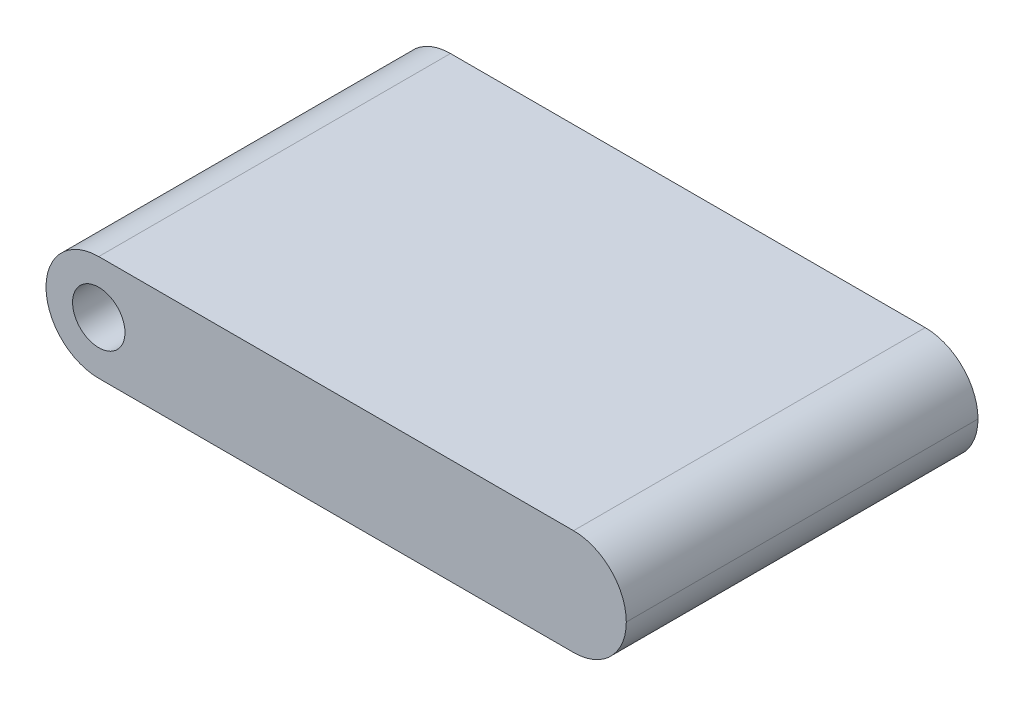
ISO-10303-21;
HEADER;
FILE_DESCRIPTION(('STEP AP214'),'2;1');
FILE_NAME('part.step','',(''),(''),'','','');
FILE_SCHEMA(('AUTOMOTIVE_DESIGN { 1 0 10303 214 1 1 1 1 }'));
ENDSEC;
DATA;
#1=APPLICATION_CONTEXT('core data for automotive mechanical design processes');
#2=APPLICATION_PROTOCOL_DEFINITION('international standard','automotive_design',2000,#1);
#3=PRODUCT_CONTEXT('',#1,'mechanical');
#4=PRODUCT('Part','Part','',(#3));
#5=PRODUCT_RELATED_PRODUCT_CATEGORY('part','',(#4));
#6=PRODUCT_DEFINITION_FORMATION('','',#4);
#7=PRODUCT_DEFINITION_CONTEXT('part definition',#1,'design');
#8=PRODUCT_DEFINITION('design','',#6,#7);
#9=PRODUCT_DEFINITION_SHAPE('','',#8);
#10=(LENGTH_UNIT() NAMED_UNIT(*) SI_UNIT(.MILLI.,.METRE.));
#11=(NAMED_UNIT(*) PLANE_ANGLE_UNIT() SI_UNIT($,.RADIAN.));
#12=(NAMED_UNIT(*) SI_UNIT($,.STERADIAN.) SOLID_ANGLE_UNIT());
#13=UNCERTAINTY_MEASURE_WITH_UNIT(LENGTH_MEASURE(1.E-05),#10,'distance_accuracy_value','');
#14=(GEOMETRIC_REPRESENTATION_CONTEXT(3) GLOBAL_UNCERTAINTY_ASSIGNED_CONTEXT((#13)) GLOBAL_UNIT_ASSIGNED_CONTEXT((#10,
#11,#12)) REPRESENTATION_CONTEXT('',''));
#15=CARTESIAN_POINT('',(0.,0.,0.));
#16=DIRECTION('',(0.,0.,1.));
#17=DIRECTION('',(1.,0.,0.));
#18=AXIS2_PLACEMENT_3D('',#15,#16,#17);
#19=CARTESIAN_POINT('',(0.,0.,20.));
#20=DIRECTION('',(0.,0.,1.));
#21=DIRECTION('',(1.,0.,0.));
#22=AXIS2_PLACEMENT_3D('',#19,#20,#21);
#23=PLANE('',#22);
#24=DIRECTION('',(1.,0.,0.));
#25=VECTOR('',#24,1.);
#26=CARTESIAN_POINT('',(-6.,-6.,20.));
#27=LINE('',#26,#25);
#28=CARTESIAN_POINT('',(0.,-6.,20.));
#29=VERTEX_POINT('',#28);
#30=CARTESIAN_POINT('',(54.,-6.,20.));
#31=VERTEX_POINT('',#30);
#32=EDGE_CURVE('E111',#29,#31,#27,.T.);
#33=ORIENTED_EDGE('',*,*,#32,.T.);
#34=CARTESIAN_POINT('',(54.,0.,20.));
#35=DIRECTION('',(0.,0.,1.));
#36=DIRECTION('',(1.,0.,0.));
#37=AXIS2_PLACEMENT_3D('',#34,#35,#36);
#38=CIRCLE('',#37,6.);
#39=CARTESIAN_POINT('',(60.,0.,20.));
#40=VERTEX_POINT('',#39);
#41=EDGE_CURVE('E138',#31,#40,#38,.T.);
#42=ORIENTED_EDGE('',*,*,#41,.T.);
#43=CARTESIAN_POINT('',(54.,0.,20.));
#44=DIRECTION('',(0.,0.,1.));
#45=DIRECTION('',(1.,0.,0.));
#46=AXIS2_PLACEMENT_3D('',#43,#44,#45);
#47=CIRCLE('',#46,6.);
#48=CARTESIAN_POINT('',(54.,6.00000000000001,20.));
#49=VERTEX_POINT('',#48);
#50=EDGE_CURVE('E136',#40,#49,#47,.T.);
#51=ORIENTED_EDGE('',*,*,#50,.T.);
#52=DIRECTION('',(-1.,0.,0.));
#53=VECTOR('',#52,1.);
#54=CARTESIAN_POINT('',(60.,6.00000000000002,20.));
#55=LINE('',#54,#53);
#56=CARTESIAN_POINT('',(0.,6.,20.));
#57=VERTEX_POINT('',#56);
#58=EDGE_CURVE('E126',#49,#57,#55,.T.);
#59=ORIENTED_EDGE('',*,*,#58,.T.);
#60=CARTESIAN_POINT('',(0.,0.,20.));
#61=DIRECTION('',(0.,0.,1.));
#62=DIRECTION('',(1.,0.,0.));
#63=AXIS2_PLACEMENT_3D('',#60,#61,#62);
#64=CIRCLE('',#63,6.);
#65=CARTESIAN_POINT('',(-6.,0.,20.));
#66=VERTEX_POINT('',#65);
#67=EDGE_CURVE('E54',#57,#66,#64,.T.);
#68=ORIENTED_EDGE('',*,*,#67,.T.);
#69=CARTESIAN_POINT('',(0.,0.,20.));
#70=DIRECTION('',(0.,0.,1.));
#71=DIRECTION('',(1.,0.,0.));
#72=AXIS2_PLACEMENT_3D('',#69,#70,#71);
#73=CIRCLE('',#72,6.);
#74=EDGE_CURVE('E134',#66,#29,#73,.T.);
#75=ORIENTED_EDGE('',*,*,#74,.T.);
#76=EDGE_LOOP('',(#33,#42,#51,#59,#68,#75));
#77=FACE_BOUND('',#76,.T.);
#78=CARTESIAN_POINT('',(0.,0.,20.));
#79=DIRECTION('',(0.,0.,1.));
#80=DIRECTION('',(1.,0.,0.));
#81=AXIS2_PLACEMENT_3D('',#78,#79,#80);
#82=CIRCLE('',#81,2.98);
#83=CARTESIAN_POINT('',(2.98,0.,20.));
#84=VERTEX_POINT('',#83);
#85=EDGE_CURVE('E119',#84,#84,#82,.T.);
#86=ORIENTED_EDGE('',*,*,#85,.F.);
#87=EDGE_LOOP('',(#86));
#88=FACE_BOUND('',#87,.T.);
#89=ADVANCED_FACE('F37',(#77,#88),#23,.T.);
#90=CARTESIAN_POINT('',(0.,0.,-20.));
#91=DIRECTION('',(0.,0.,1.));
#92=DIRECTION('',(1.,0.,0.));
#93=AXIS2_PLACEMENT_3D('',#90,#91,#92);
#94=PLANE('',#93);
#95=CARTESIAN_POINT('',(54.,0.,-20.));
#96=DIRECTION('',(0.,0.,1.));
#97=DIRECTION('',(1.,0.,0.));
#98=AXIS2_PLACEMENT_3D('',#95,#96,#97);
#99=CIRCLE('',#98,6.);
#100=CARTESIAN_POINT('',(54.,6.00000000000001,-20.));
#101=VERTEX_POINT('',#100);
#102=CARTESIAN_POINT('',(60.,0.,-20.));
#103=VERTEX_POINT('',#102);
#104=EDGE_CURVE('E100',#101,#103,#99,.F.);
#105=ORIENTED_EDGE('',*,*,#104,.T.);
#106=CARTESIAN_POINT('',(54.,0.,-20.));
#107=DIRECTION('',(0.,0.,1.));
#108=DIRECTION('',(1.,0.,0.));
#109=AXIS2_PLACEMENT_3D('',#106,#107,#108);
#110=CIRCLE('',#109,6.);
#111=CARTESIAN_POINT('',(54.,-6.,-20.));
#112=VERTEX_POINT('',#111);
#113=EDGE_CURVE('E113',#103,#112,#110,.F.);
#114=ORIENTED_EDGE('',*,*,#113,.T.);
#115=DIRECTION('',(1.,0.,0.));
#116=VECTOR('',#115,1.);
#117=CARTESIAN_POINT('',(-6.,-6.,-20.));
#118=LINE('',#117,#116);
#119=CARTESIAN_POINT('',(0.,-6.,-20.));
#120=VERTEX_POINT('',#119);
#121=EDGE_CURVE('E108',#120,#112,#118,.T.);
#122=ORIENTED_EDGE('',*,*,#121,.F.);
#123=CARTESIAN_POINT('',(0.,0.,-20.));
#124=DIRECTION('',(0.,0.,1.));
#125=DIRECTION('',(1.,0.,0.));
#126=AXIS2_PLACEMENT_3D('',#123,#124,#125);
#127=CIRCLE('',#126,6.);
#128=CARTESIAN_POINT('',(-6.,0.,-20.));
#129=VERTEX_POINT('',#128);
#130=EDGE_CURVE('E92',#120,#129,#127,.F.);
#131=ORIENTED_EDGE('',*,*,#130,.T.);
#132=CARTESIAN_POINT('',(0.,0.,-20.));
#133=DIRECTION('',(0.,0.,1.));
#134=DIRECTION('',(1.,0.,0.));
#135=AXIS2_PLACEMENT_3D('',#132,#133,#134);
#136=CIRCLE('',#135,6.);
#137=CARTESIAN_POINT('',(0.,6.,-20.));
#138=VERTEX_POINT('',#137);
#139=EDGE_CURVE('E101',#129,#138,#136,.F.);
#140=ORIENTED_EDGE('',*,*,#139,.T.);
#141=DIRECTION('',(-1.,0.,0.));
#142=VECTOR('',#141,1.);
#143=CARTESIAN_POINT('',(60.,6.00000000000002,-20.));
#144=LINE('',#143,#142);
#145=EDGE_CURVE('E118',#101,#138,#144,.T.);
#146=ORIENTED_EDGE('',*,*,#145,.F.);
#147=EDGE_LOOP('',(#105,#114,#122,#131,#140,#146));
#148=FACE_BOUND('',#147,.T.);
#149=CARTESIAN_POINT('',(0.,0.,-20.));
#150=DIRECTION('',(0.,0.,1.));
#151=DIRECTION('',(1.,0.,0.));
#152=AXIS2_PLACEMENT_3D('',#149,#150,#151);
#153=CIRCLE('',#152,2.98);
#154=CARTESIAN_POINT('',(2.98,0.,-20.));
#155=VERTEX_POINT('',#154);
#156=EDGE_CURVE('E123',#155,#155,#153,.T.);
#157=ORIENTED_EDGE('',*,*,#156,.T.);
#158=EDGE_LOOP('',(#157));
#159=FACE_BOUND('',#158,.T.);
#160=ADVANCED_FACE('F115',(#148,#159),#94,.F.);
#161=CARTESIAN_POINT('',(-6.,-6.,20.));
#162=DIRECTION('',(0.,1.,0.));
#163=DIRECTION('',(0.,0.,1.));
#164=AXIS2_PLACEMENT_3D('',#161,#162,#163);
#165=PLANE('',#164);
#166=ORIENTED_EDGE('',*,*,#121,.T.);
#167=DIRECTION('',(0.,0.,-1.));
#168=VECTOR('',#167,1.);
#169=CARTESIAN_POINT('',(54.,-6.,20.));
#170=LINE('',#169,#168);
#171=EDGE_CURVE('E112',#112,#31,#170,.F.);
#172=ORIENTED_EDGE('',*,*,#171,.T.);
#173=ORIENTED_EDGE('',*,*,#32,.F.);
#174=DIRECTION('',(0.,0.,-1.));
#175=VECTOR('',#174,1.);
#176=CARTESIAN_POINT('',(0.,-6.,20.));
#177=LINE('',#176,#175);
#178=EDGE_CURVE('E96',#29,#120,#177,.T.);
#179=ORIENTED_EDGE('',*,*,#178,.T.);
#180=EDGE_LOOP('',(#166,#172,#173,#179));
#181=FACE_BOUND('',#180,.T.);
#182=ADVANCED_FACE('F106',(#181),#165,.F.);
#183=CARTESIAN_POINT('',(60.,6.00000000000002,20.));
#184=DIRECTION('',(0.,-1.,0.));
#185=DIRECTION('',(1.,0.,0.));
#186=AXIS2_PLACEMENT_3D('',#183,#184,#185);
#187=PLANE('',#186);
#188=ORIENTED_EDGE('',*,*,#58,.F.);
#189=DIRECTION('',(0.,0.,-1.));
#190=VECTOR('',#189,1.);
#191=CARTESIAN_POINT('',(54.,6.00000000000001,20.));
#192=LINE('',#191,#190);
#193=EDGE_CURVE('E11',#49,#101,#192,.T.);
#194=ORIENTED_EDGE('',*,*,#193,.T.);
#195=ORIENTED_EDGE('',*,*,#145,.T.);
#196=DIRECTION('',(0.,0.,-1.));
#197=VECTOR('',#196,1.);
#198=CARTESIAN_POINT('',(0.,6.,20.));
#199=LINE('',#198,#197);
#200=EDGE_CURVE('E46',#138,#57,#199,.F.);
#201=ORIENTED_EDGE('',*,*,#200,.T.);
#202=EDGE_LOOP('',(#188,#194,#195,#201));
#203=FACE_BOUND('',#202,.T.);
#204=ADVANCED_FACE('F153',(#203),#187,.F.);
#205=CARTESIAN_POINT('',(0.,0.,20.));
#206=DIRECTION('',(0.,0.,-1.));
#207=DIRECTION('',(-1.,0.,0.));
#208=AXIS2_PLACEMENT_3D('',#205,#206,#207);
#209=CYLINDRICAL_SURFACE('',#208,2.98);
#210=ORIENTED_EDGE('',*,*,#85,.T.);
#211=EDGE_LOOP('',(#210));
#212=FACE_BOUND('',#211,.T.);
#213=ORIENTED_EDGE('',*,*,#156,.F.);
#214=EDGE_LOOP('',(#213));
#215=FACE_BOUND('',#214,.T.);
#216=ADVANCED_FACE('F163',(#212,#215),#209,.F.);
#217=CARTESIAN_POINT('',(54.,0.,20.));
#218=DIRECTION('',(0.,0.,-1.));
#219=DIRECTION('',(-1.,0.,0.));
#220=AXIS2_PLACEMENT_3D('',#217,#218,#219);
#221=CYLINDRICAL_SURFACE('',#220,6.);
#222=ORIENTED_EDGE('',*,*,#193,.F.);
#223=ORIENTED_EDGE('',*,*,#50,.F.);
#224=DIRECTION('',(0.,0.,-1.));
#225=VECTOR('',#224,1.);
#226=CARTESIAN_POINT('',(60.,0.,20.));
#227=LINE('',#226,#225);
#228=EDGE_CURVE('E140',#103,#40,#227,.F.);
#229=ORIENTED_EDGE('',*,*,#228,.F.);
#230=ORIENTED_EDGE('',*,*,#104,.F.);
#231=EDGE_LOOP('',(#222,#223,#229,#230));
#232=FACE_BOUND('',#231,.T.);
#233=ADVANCED_FACE('F155',(#232),#221,.T.);
#234=CARTESIAN_POINT('',(54.,0.,20.));
#235=DIRECTION('',(0.,0.,-1.));
#236=DIRECTION('',(-1.,0.,0.));
#237=AXIS2_PLACEMENT_3D('',#234,#235,#236);
#238=CYLINDRICAL_SURFACE('',#237,6.);
#239=ORIENTED_EDGE('',*,*,#41,.F.);
#240=ORIENTED_EDGE('',*,*,#171,.F.);
#241=ORIENTED_EDGE('',*,*,#113,.F.);
#242=ORIENTED_EDGE('',*,*,#228,.T.);
#243=EDGE_LOOP('',(#239,#240,#241,#242));
#244=FACE_BOUND('',#243,.T.);
#245=ADVANCED_FACE('F156',(#244),#238,.T.);
#246=CARTESIAN_POINT('',(0.,0.,20.));
#247=DIRECTION('',(0.,0.,-1.));
#248=DIRECTION('',(-1.,0.,0.));
#249=AXIS2_PLACEMENT_3D('',#246,#247,#248);
#250=CYLINDRICAL_SURFACE('',#249,6.);
#251=DIRECTION('',(0.,0.,-1.));
#252=VECTOR('',#251,1.);
#253=CARTESIAN_POINT('',(-6.,0.,20.));
#254=LINE('',#253,#252);
#255=EDGE_CURVE('E41',#66,#129,#254,.T.);
#256=ORIENTED_EDGE('',*,*,#255,.F.);
#257=ORIENTED_EDGE('',*,*,#67,.F.);
#258=ORIENTED_EDGE('',*,*,#200,.F.);
#259=ORIENTED_EDGE('',*,*,#139,.F.);
#260=EDGE_LOOP('',(#256,#257,#258,#259));
#261=FACE_BOUND('',#260,.T.);
#262=ADVANCED_FACE('F39',(#261),#250,.T.);
#263=CARTESIAN_POINT('',(0.,0.,20.));
#264=DIRECTION('',(0.,0.,-1.));
#265=DIRECTION('',(-1.,0.,0.));
#266=AXIS2_PLACEMENT_3D('',#263,#264,#265);
#267=CYLINDRICAL_SURFACE('',#266,6.);
#268=ORIENTED_EDGE('',*,*,#74,.F.);
#269=ORIENTED_EDGE('',*,*,#255,.T.);
#270=ORIENTED_EDGE('',*,*,#130,.F.);
#271=ORIENTED_EDGE('',*,*,#178,.F.);
#272=EDGE_LOOP('',(#268,#269,#270,#271));
#273=FACE_BOUND('',#272,.T.);
#274=ADVANCED_FACE('F95',(#273),#267,.T.);
#275=CLOSED_SHELL('',(#89,#160,#182,#204,#216,#233,#245,#262,#274));
#276=MANIFOLD_SOLID_BREP('B2',#275);
#277=ADVANCED_BREP_SHAPE_REPRESENTATION('',(#18,#276),#14);
#278=SHAPE_DEFINITION_REPRESENTATION(#9,#277);
ENDSEC;
END-ISO-10303-21;
